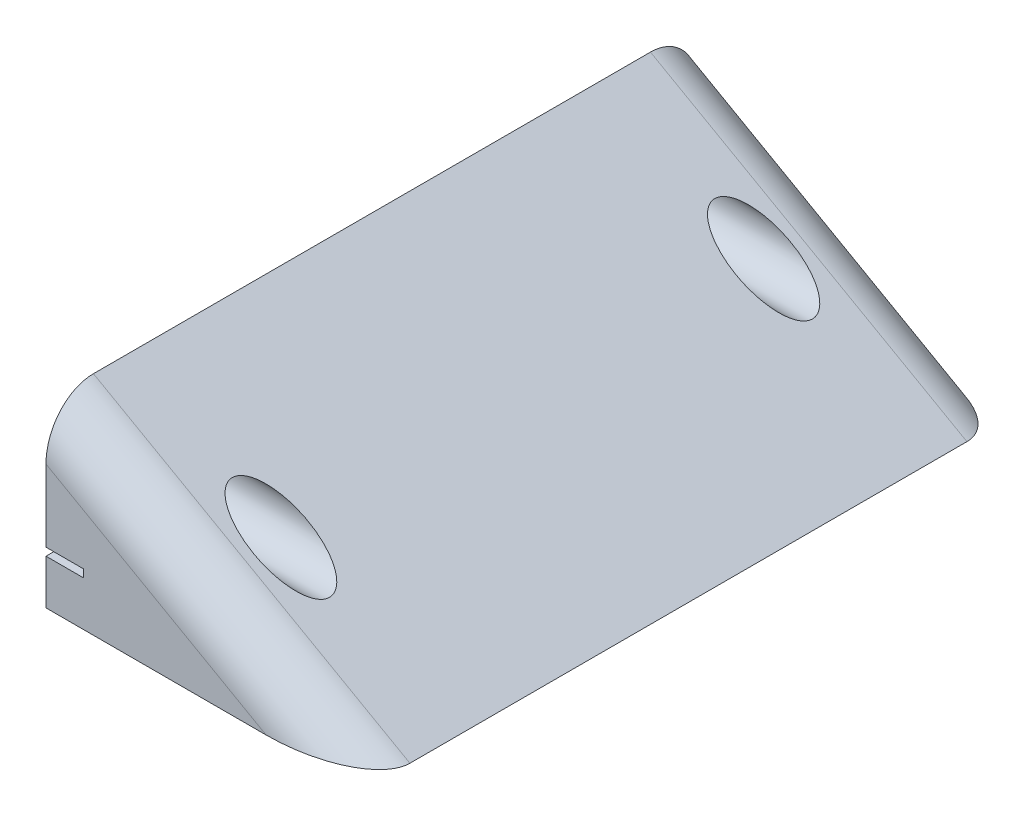
ISO-10303-21;
HEADER;
FILE_DESCRIPTION(('STEP AP214'),'2;1');
FILE_NAME('part.step','',(''),(''),'','','');
FILE_SCHEMA(('AUTOMOTIVE_DESIGN { 1 0 10303 214 1 1 1 1 }'));
ENDSEC;
DATA;
#1=APPLICATION_CONTEXT('core data for automotive mechanical design processes');
#2=APPLICATION_PROTOCOL_DEFINITION('international standard','automotive_design',2000,#1);
#3=PRODUCT_CONTEXT('',#1,'mechanical');
#4=PRODUCT('Part','Part','',(#3));
#5=PRODUCT_RELATED_PRODUCT_CATEGORY('part','',(#4));
#6=PRODUCT_DEFINITION_FORMATION('','',#4);
#7=PRODUCT_DEFINITION_CONTEXT('part definition',#1,'design');
#8=PRODUCT_DEFINITION('design','',#6,#7);
#9=PRODUCT_DEFINITION_SHAPE('','',#8);
#10=(LENGTH_UNIT() NAMED_UNIT(*) SI_UNIT(.MILLI.,.METRE.));
#11=(NAMED_UNIT(*) PLANE_ANGLE_UNIT() SI_UNIT($,.RADIAN.));
#12=(NAMED_UNIT(*) SI_UNIT($,.STERADIAN.) SOLID_ANGLE_UNIT());
#13=UNCERTAINTY_MEASURE_WITH_UNIT(LENGTH_MEASURE(1.E-05),#10,'distance_accuracy_value','');
#14=(GEOMETRIC_REPRESENTATION_CONTEXT(3) GLOBAL_UNCERTAINTY_ASSIGNED_CONTEXT((#13)) GLOBAL_UNIT_ASSIGNED_CONTEXT((#10,
#11,#12)) REPRESENTATION_CONTEXT('',''));
#15=CARTESIAN_POINT('',(0.,0.,0.));
#16=DIRECTION('',(0.,0.,1.));
#17=DIRECTION('',(1.,0.,0.));
#18=AXIS2_PLACEMENT_3D('',#15,#16,#17);
#19=CARTESIAN_POINT('',(0.,0.,261.62));
#20=DIRECTION('',(1.,0.,0.));
#21=DIRECTION('',(0.,0.,-1.));
#22=AXIS2_PLACEMENT_3D('',#19,#20,#21);
#23=PLANE('',#22);
#24=DIRECTION('',(0.,-1.,0.));
#25=VECTOR('',#24,1.);
#26=CARTESIAN_POINT('',(0.,0.,261.62));
#27=LINE('',#26,#25);
#28=CARTESIAN_POINT('',(0.,17.976314939689,261.62));
#29=VERTEX_POINT('',#28);
#30=CARTESIAN_POINT('',(0.,0.,261.62));
#31=VERTEX_POINT('',#30);
#32=EDGE_CURVE('E179',#29,#31,#27,.T.);
#33=ORIENTED_EDGE('',*,*,#32,.F.);
#34=DIRECTION('',(0.,0.,1.));
#35=VECTOR('',#34,1.);
#36=CARTESIAN_POINT('',(0.,17.976314939689,-6.604));
#37=LINE('',#36,#35);
#38=CARTESIAN_POINT('',(0.,17.976314939689,0.));
#39=VERTEX_POINT('',#38);
#40=EDGE_CURVE('E155',#39,#29,#37,.T.);
#41=ORIENTED_EDGE('',*,*,#40,.F.);
#42=DIRECTION('',(0.,-1.,0.));
#43=VECTOR('',#42,1.);
#44=CARTESIAN_POINT('',(0.,0.,0.));
#45=LINE('',#44,#43);
#46=CARTESIAN_POINT('',(0.,0.,0.));
#47=VERTEX_POINT('',#46);
#48=EDGE_CURVE('E186',#39,#47,#45,.T.);
#49=ORIENTED_EDGE('',*,*,#48,.T.);
#50=DIRECTION('',(0.,0.,-1.));
#51=VECTOR('',#50,1.);
#52=CARTESIAN_POINT('',(0.,0.,261.62));
#53=LINE('',#52,#51);
#54=EDGE_CURVE('E183',#31,#47,#53,.T.);
#55=ORIENTED_EDGE('',*,*,#54,.F.);
#56=EDGE_LOOP('',(#33,#41,#49,#55));
#57=FACE_BOUND('',#56,.T.);
#58=ADVANCED_FACE('F44',(#57),#23,.F.);
#59=CARTESIAN_POINT('',(0.,0.,261.62));
#60=DIRECTION('',(0.,1.,0.));
#61=DIRECTION('',(0.,0.,1.));
#62=AXIS2_PLACEMENT_3D('',#59,#60,#61);
#63=PLANE('',#62);
#64=DIRECTION('',(0.,0.,-1.));
#65=VECTOR('',#64,1.);
#66=CARTESIAN_POINT('',(127.,0.,261.62));
#67=LINE('',#66,#65);
#68=CARTESIAN_POINT('',(127.,0.,242.57));
#69=VERTEX_POINT('',#68);
#70=CARTESIAN_POINT('',(127.,0.,19.05));
#71=VERTEX_POINT('',#70);
#72=EDGE_CURVE('E196',#69,#71,#67,.T.);
#73=ORIENTED_EDGE('',*,*,#72,.F.);
#74=CARTESIAN_POINT('',(88.3255567421224,0.,242.57));
#75=DIRECTION('',(0.,1.,0.));
#76=DIRECTION('',(1.,0.,0.));
#77=AXIS2_PLACEMENT_3D('',#74,#75,#76);
#78=ELLIPSE('',#77,38.6744432578776,19.05);
#79=CARTESIAN_POINT('',(88.3255567421224,0.,261.62));
#80=VERTEX_POINT('',#79);
#81=EDGE_CURVE('E53',#69,#80,#78,.F.);
#82=ORIENTED_EDGE('',*,*,#81,.T.);
#83=DIRECTION('',(1.,0.,0.));
#84=VECTOR('',#83,1.);
#85=CARTESIAN_POINT('',(0.,0.,261.62));
#86=LINE('',#85,#84);
#87=EDGE_CURVE('E176',#31,#80,#86,.T.);
#88=ORIENTED_EDGE('',*,*,#87,.F.);
#89=ORIENTED_EDGE('',*,*,#54,.T.);
#90=DIRECTION('',(1.,0.,0.));
#91=VECTOR('',#90,1.);
#92=CARTESIAN_POINT('',(0.,0.,0.));
#93=LINE('',#92,#91);
#94=CARTESIAN_POINT('',(88.3255567421224,0.,0.));
#95=VERTEX_POINT('',#94);
#96=EDGE_CURVE('E175',#47,#95,#93,.T.);
#97=ORIENTED_EDGE('',*,*,#96,.T.);
#98=CARTESIAN_POINT('',(88.3255567421224,0.,19.05));
#99=DIRECTION('',(0.,1.,0.));
#100=DIRECTION('',(-1.,0.,0.));
#101=AXIS2_PLACEMENT_3D('',#98,#99,#100);
#102=ELLIPSE('',#101,38.6744432578776,19.05);
#103=EDGE_CURVE('E65',#95,#71,#102,.F.);
#104=ORIENTED_EDGE('',*,*,#103,.T.);
#105=EDGE_LOOP('',(#73,#82,#88,#89,#97,#104));
#106=FACE_BOUND('',#105,.T.);
#107=ADVANCED_FACE('F228',(#106),#63,.F.);
#108=CARTESIAN_POINT('',(0.,71.882,261.62));
#109=DIRECTION('',(-0.492573348062863,-0.870270932973256,0.));
#110=DIRECTION('',(0.870270932973256,-0.492573348062863,0.));
#111=AXIS2_PLACEMENT_3D('',#108,#109,#110);
#112=PLANE('',#111);
#113=CARTESIAN_POINT('',(60.3586572438163,37.719,34.0011761452781));
#114=DIRECTION('',(-0.492573348062863,-0.870270932973256,0.));
#115=DIRECTION('',(-0.870270932973256,0.492573348062863,0.));
#116=AXIS2_PLACEMENT_3D('',#113,#114,#115);
#117=ELLIPSE('',#116,22.5419220593044,11.1035500205237);
#118=CARTESIAN_POINT('',(40.741077702255,48.8225500205237,34.0011761452781));
#119=VERTEX_POINT('',#118);
#120=EDGE_CURVE('E171',#119,#119,#117,.T.);
#121=ORIENTED_EDGE('',*,*,#120,.T.);
#122=EDGE_LOOP('',(#121));
#123=FACE_BOUND('',#122,.T.);
#124=CARTESIAN_POINT('',(60.3586572438163,37.719,227.711));
#125=DIRECTION('',(-0.492573348062863,-0.870270932973256,0.));
#126=DIRECTION('',(-0.870270932973256,0.492573348062863,0.));
#127=AXIS2_PLACEMENT_3D('',#124,#125,#126);
#128=ELLIPSE('',#127,22.431177089569,11.049);
#129=CARTESIAN_POINT('',(40.8374558303887,48.768,227.711));
#130=VERTEX_POINT('',#129);
#131=EDGE_CURVE('E164',#130,#130,#128,.T.);
#132=ORIENTED_EDGE('',*,*,#131,.T.);
#133=EDGE_LOOP('',(#132));
#134=FACE_BOUND('',#133,.T.);
#135=DIRECTION('',(0.,0.,-1.));
#136=VECTOR('',#135,1.);
#137=CARTESIAN_POINT('',(0.,71.882,261.62));
#138=LINE('',#137,#136);
#139=CARTESIAN_POINT('',(0.,71.882,242.57));
#140=VERTEX_POINT('',#139);
#141=CARTESIAN_POINT('',(0.,71.882,19.05));
#142=VERTEX_POINT('',#141);
#143=EDGE_CURVE('E192',#140,#142,#138,.T.);
#144=ORIENTED_EDGE('',*,*,#143,.F.);
#145=DIRECTION('',(-0.870270932973256,0.492573348062863,0.));
#146=VECTOR('',#145,1.);
#147=CARTESIAN_POINT('',(127.,0.,242.57));
#148=LINE('',#147,#146);
#149=EDGE_CURVE('E221',#140,#69,#148,.F.);
#150=ORIENTED_EDGE('',*,*,#149,.T.);
#151=ORIENTED_EDGE('',*,*,#72,.T.);
#152=DIRECTION('',(-0.870270932973256,0.492573348062863,0.));
#153=VECTOR('',#152,1.);
#154=CARTESIAN_POINT('',(0.,71.882,19.05));
#155=LINE('',#154,#153);
#156=EDGE_CURVE('E217',#71,#142,#155,.T.);
#157=ORIENTED_EDGE('',*,*,#156,.T.);
#158=EDGE_LOOP('',(#144,#150,#151,#157));
#159=FACE_BOUND('',#158,.T.);
#160=ADVANCED_FACE('F239',(#123,#134,#159),#112,.F.);
#161=CARTESIAN_POINT('',(0.,37.719,34.0011761452781));
#162=DIRECTION('',(-1.,0.,0.));
#163=DIRECTION('',(0.,0.,1.));
#164=AXIS2_PLACEMENT_3D('',#161,#162,#163);
#165=CIRCLE('',#164,11.1035500205237);
#166=CARTESIAN_POINT('',(0.,37.719,45.1047261658018));
#167=VERTEX_POINT('',#166);
#168=EDGE_CURVE('E160',#167,#167,#165,.T.);
#169=ORIENTED_EDGE('',*,*,#168,.F.);
#170=EDGE_LOOP('',(#169));
#171=FACE_BOUND('',#170,.T.);
#172=CARTESIAN_POINT('',(0.,37.719,227.711));
#173=DIRECTION('',(-1.,0.,0.));
#174=DIRECTION('',(0.,0.,1.));
#175=AXIS2_PLACEMENT_3D('',#172,#173,#174);
#176=CIRCLE('',#175,11.049);
#177=CARTESIAN_POINT('',(0.,37.719,238.76));
#178=VERTEX_POINT('',#177);
#179=EDGE_CURVE('E154',#178,#178,#176,.T.);
#180=ORIENTED_EDGE('',*,*,#179,.F.);
#181=EDGE_LOOP('',(#180));
#182=FACE_BOUND('',#181,.T.);
#183=CARTESIAN_POINT('',(0.,49.9922651160413,261.62));
#184=VERTEX_POINT('',#183);
#185=CARTESIAN_POINT('',(0.,21.1006079936563,261.62));
#186=VERTEX_POINT('',#185);
#187=EDGE_CURVE('E146',#184,#186,#27,.T.);
#188=ORIENTED_EDGE('',*,*,#187,.F.);
#189=CARTESIAN_POINT('',(0.,49.9922651160413,242.57));
#190=DIRECTION('',(1.,0.,0.));
#191=DIRECTION('',(0.,-1.,0.));
#192=AXIS2_PLACEMENT_3D('',#189,#190,#191);
#193=ELLIPSE('',#192,21.8897348839587,19.05);
#194=EDGE_CURVE('E214',#184,#140,#193,.F.);
#195=ORIENTED_EDGE('',*,*,#194,.T.);
#196=ORIENTED_EDGE('',*,*,#143,.T.);
#197=CARTESIAN_POINT('',(0.,49.9922651160413,19.05));
#198=DIRECTION('',(1.,0.,0.));
#199=DIRECTION('',(0.,1.,0.));
#200=AXIS2_PLACEMENT_3D('',#197,#198,#199);
#201=ELLIPSE('',#200,21.8897348839587,19.05);
#202=CARTESIAN_POINT('',(0.,49.9922651160413,0.));
#203=VERTEX_POINT('',#202);
#204=EDGE_CURVE('E211',#142,#203,#201,.F.);
#205=ORIENTED_EDGE('',*,*,#204,.T.);
#206=CARTESIAN_POINT('',(0.,21.1006079936563,0.));
#207=VERTEX_POINT('',#206);
#208=EDGE_CURVE('E180',#203,#207,#45,.T.);
#209=ORIENTED_EDGE('',*,*,#208,.T.);
#210=DIRECTION('',(0.,0.,1.));
#211=VECTOR('',#210,1.);
#212=CARTESIAN_POINT('',(0.,21.1006079936563,-6.604));
#213=LINE('',#212,#211);
#214=EDGE_CURVE('E129',#207,#186,#213,.T.);
#215=ORIENTED_EDGE('',*,*,#214,.T.);
#216=EDGE_LOOP('',(#188,#195,#196,#205,#209,#215));
#217=FACE_BOUND('',#216,.T.);
#218=ADVANCED_FACE('F237',(#171,#182,#217),#23,.F.);
#219=CARTESIAN_POINT('',(0.,0.,261.62));
#220=DIRECTION('',(0.,0.,1.));
#221=DIRECTION('',(1.,0.,0.));
#222=AXIS2_PLACEMENT_3D('',#219,#220,#221);
#223=PLANE('',#222);
#224=ORIENTED_EDGE('',*,*,#87,.T.);
#225=DIRECTION('',(-0.870270932973256,0.492573348062863,0.));
#226=VECTOR('',#225,1.);
#227=CARTESIAN_POINT('',(-9.38352228059755,55.3033387268595,261.62));
#228=LINE('',#227,#226);
#229=EDGE_CURVE('E208',#80,#184,#228,.T.);
#230=ORIENTED_EDGE('',*,*,#229,.T.);
#231=ORIENTED_EDGE('',*,*,#187,.T.);
#232=DIRECTION('',(-1.,0.,0.));
#233=VECTOR('',#232,1.);
#234=CARTESIAN_POINT('',(14.986,21.1006079936563,261.62));
#235=LINE('',#234,#233);
#236=CARTESIAN_POINT('',(14.986,21.1006079936563,261.62));
#237=VERTEX_POINT('',#236);
#238=EDGE_CURVE('E122',#237,#186,#235,.T.);
#239=ORIENTED_EDGE('',*,*,#238,.F.);
#240=DIRECTION('',(0.,1.,0.));
#241=VECTOR('',#240,1.);
#242=CARTESIAN_POINT('',(14.986,21.1006079936563,261.62));
#243=LINE('',#242,#241);
#244=CARTESIAN_POINT('',(14.986,17.976314939689,261.62));
#245=VERTEX_POINT('',#244);
#246=EDGE_CURVE('E133',#245,#237,#243,.T.);
#247=ORIENTED_EDGE('',*,*,#246,.F.);
#248=DIRECTION('',(1.,0.,0.));
#249=VECTOR('',#248,1.);
#250=CARTESIAN_POINT('',(14.986,17.976314939689,261.62));
#251=LINE('',#250,#249);
#252=EDGE_CURVE('E130',#29,#245,#251,.T.);
#253=ORIENTED_EDGE('',*,*,#252,.F.);
#254=ORIENTED_EDGE('',*,*,#32,.T.);
#255=EDGE_LOOP('',(#224,#230,#231,#239,#247,#253,#254));
#256=FACE_BOUND('',#255,.T.);
#257=ADVANCED_FACE('F143',(#256),#223,.T.);
#258=CARTESIAN_POINT('',(0.,0.,0.));
#259=DIRECTION('',(0.,0.,1.));
#260=DIRECTION('',(1.,0.,0.));
#261=AXIS2_PLACEMENT_3D('',#258,#259,#260);
#262=PLANE('',#261);
#263=ORIENTED_EDGE('',*,*,#208,.F.);
#264=DIRECTION('',(-0.870270932973256,0.492573348062863,0.));
#265=VECTOR('',#264,1.);
#266=CARTESIAN_POINT('',(21.4302976285785,37.8627166582658,0.));
#267=LINE('',#266,#265);
#268=EDGE_CURVE('E11',#203,#95,#267,.F.);
#269=ORIENTED_EDGE('',*,*,#268,.T.);
#270=ORIENTED_EDGE('',*,*,#96,.F.);
#271=ORIENTED_EDGE('',*,*,#48,.F.);
#272=DIRECTION('',(1.,0.,0.));
#273=VECTOR('',#272,1.);
#274=CARTESIAN_POINT('',(0.,17.976314939689,0.));
#275=LINE('',#274,#273);
#276=CARTESIAN_POINT('',(14.986,17.976314939689,0.));
#277=VERTEX_POINT('',#276);
#278=EDGE_CURVE('E204',#39,#277,#275,.T.);
#279=ORIENTED_EDGE('',*,*,#278,.T.);
#280=DIRECTION('',(0.,1.,0.));
#281=VECTOR('',#280,1.);
#282=CARTESIAN_POINT('',(14.986,0.,0.));
#283=LINE('',#282,#281);
#284=CARTESIAN_POINT('',(14.986,21.1006079936563,0.));
#285=VERTEX_POINT('',#284);
#286=EDGE_CURVE('E201',#277,#285,#283,.T.);
#287=ORIENTED_EDGE('',*,*,#286,.T.);
#288=DIRECTION('',(-1.,0.,0.));
#289=VECTOR('',#288,1.);
#290=CARTESIAN_POINT('',(0.,21.1006079936563,0.));
#291=LINE('',#290,#289);
#292=EDGE_CURVE('E125',#285,#207,#291,.T.);
#293=ORIENTED_EDGE('',*,*,#292,.T.);
#294=EDGE_LOOP('',(#263,#269,#270,#271,#279,#287,#293));
#295=FACE_BOUND('',#294,.T.);
#296=ADVANCED_FACE('F242',(#295),#262,.F.);
#297=CARTESIAN_POINT('',(109.728,37.719,227.711));
#298=DIRECTION('',(-1.,0.,0.));
#299=DIRECTION('',(0.,0.,1.));
#300=AXIS2_PLACEMENT_3D('',#297,#298,#299);
#301=CYLINDRICAL_SURFACE('',#300,11.049);
#302=ORIENTED_EDGE('',*,*,#179,.T.);
#303=EDGE_LOOP('',(#302));
#304=FACE_BOUND('',#303,.T.);
#305=ORIENTED_EDGE('',*,*,#131,.F.);
#306=EDGE_LOOP('',(#305));
#307=FACE_BOUND('',#306,.T.);
#308=ADVANCED_FACE('F272',(#304,#307),#301,.F.);
#309=CARTESIAN_POINT('',(109.728,37.719,34.0011761452781));
#310=DIRECTION('',(-1.,0.,0.));
#311=DIRECTION('',(0.,0.,1.));
#312=AXIS2_PLACEMENT_3D('',#309,#310,#311);
#313=CYLINDRICAL_SURFACE('',#312,11.1035500205237);
#314=ORIENTED_EDGE('',*,*,#168,.T.);
#315=EDGE_LOOP('',(#314));
#316=FACE_BOUND('',#315,.T.);
#317=ORIENTED_EDGE('',*,*,#120,.F.);
#318=EDGE_LOOP('',(#317));
#319=FACE_BOUND('',#318,.T.);
#320=ADVANCED_FACE('F275',(#316,#319),#313,.F.);
#321=CARTESIAN_POINT('',(14.986,21.1006079936563,-6.604));
#322=DIRECTION('',(1.,0.,0.));
#323=DIRECTION('',(0.,1.,0.));
#324=AXIS2_PLACEMENT_3D('',#321,#322,#323);
#325=PLANE('',#324);
#326=DIRECTION('',(0.,0.,1.));
#327=VECTOR('',#326,1.);
#328=CARTESIAN_POINT('',(14.986,17.976314939689,-6.604));
#329=LINE('',#328,#327);
#330=EDGE_CURVE('E136',#277,#245,#329,.T.);
#331=ORIENTED_EDGE('',*,*,#330,.T.);
#332=ORIENTED_EDGE('',*,*,#246,.T.);
#333=DIRECTION('',(0.,0.,1.));
#334=VECTOR('',#333,1.);
#335=CARTESIAN_POINT('',(14.986,21.1006079936563,-6.604));
#336=LINE('',#335,#334);
#337=EDGE_CURVE('E117',#285,#237,#336,.T.);
#338=ORIENTED_EDGE('',*,*,#337,.F.);
#339=ORIENTED_EDGE('',*,*,#286,.F.);
#340=EDGE_LOOP('',(#331,#332,#338,#339));
#341=FACE_BOUND('',#340,.T.);
#342=ADVANCED_FACE('F134',(#341),#325,.F.);
#343=CARTESIAN_POINT('',(14.986,17.976314939689,-6.604));
#344=DIRECTION('',(0.,-1.,0.));
#345=DIRECTION('',(0.,0.,-1.));
#346=AXIS2_PLACEMENT_3D('',#343,#344,#345);
#347=PLANE('',#346);
#348=ORIENTED_EDGE('',*,*,#40,.T.);
#349=ORIENTED_EDGE('',*,*,#252,.T.);
#350=ORIENTED_EDGE('',*,*,#330,.F.);
#351=ORIENTED_EDGE('',*,*,#278,.F.);
#352=EDGE_LOOP('',(#348,#349,#350,#351));
#353=FACE_BOUND('',#352,.T.);
#354=ADVANCED_FACE('F245',(#353),#347,.F.);
#355=CARTESIAN_POINT('',(14.986,21.1006079936563,-6.604));
#356=DIRECTION('',(0.,1.,0.));
#357=DIRECTION('',(-1.,0.,0.));
#358=AXIS2_PLACEMENT_3D('',#355,#356,#357);
#359=PLANE('',#358);
#360=ORIENTED_EDGE('',*,*,#337,.T.);
#361=ORIENTED_EDGE('',*,*,#238,.T.);
#362=ORIENTED_EDGE('',*,*,#214,.F.);
#363=ORIENTED_EDGE('',*,*,#292,.F.);
#364=EDGE_LOOP('',(#360,#361,#362,#363));
#365=FACE_BOUND('',#364,.T.);
#366=ADVANCED_FACE('F119',(#365),#359,.F.);
#367=CARTESIAN_POINT('',(21.4302976285785,37.8627166582658,242.57));
#368=DIRECTION('',(0.870270932973256,-0.492573348062863,0.));
#369=DIRECTION('',(0.492573348062863,0.870270932973256,0.));
#370=AXIS2_PLACEMENT_3D('',#367,#368,#369);
#371=CYLINDRICAL_SURFACE('',#370,19.05);
#372=ORIENTED_EDGE('',*,*,#81,.F.);
#373=ORIENTED_EDGE('',*,*,#149,.F.);
#374=ORIENTED_EDGE('',*,*,#194,.F.);
#375=ORIENTED_EDGE('',*,*,#229,.F.);
#376=EDGE_LOOP('',(#372,#373,#374,#375));
#377=FACE_BOUND('',#376,.T.);
#378=ADVANCED_FACE('F234',(#377),#371,.T.);
#379=CARTESIAN_POINT('',(-9.38352228059754,55.3033387268595,19.05));
#380=DIRECTION('',(-0.870270932973256,0.492573348062863,0.));
#381=DIRECTION('',(-0.492573348062863,-0.870270932973256,0.));
#382=AXIS2_PLACEMENT_3D('',#379,#380,#381);
#383=CYLINDRICAL_SURFACE('',#382,19.05);
#384=ORIENTED_EDGE('',*,*,#103,.F.);
#385=ORIENTED_EDGE('',*,*,#268,.F.);
#386=ORIENTED_EDGE('',*,*,#204,.F.);
#387=ORIENTED_EDGE('',*,*,#156,.F.);
#388=EDGE_LOOP('',(#384,#385,#386,#387));
#389=FACE_BOUND('',#388,.T.);
#390=ADVANCED_FACE('F46',(#389),#383,.T.);
#391=CLOSED_SHELL('',(#58,#107,#160,#218,#257,#296,#308,#320,#342,#354,#366,#378,#390));
#392=MANIFOLD_SOLID_BREP('B2',#391);
#393=ADVANCED_BREP_SHAPE_REPRESENTATION('',(#18,#392),#14);
#394=SHAPE_DEFINITION_REPRESENTATION(#9,#393);
ENDSEC;
END-ISO-10303-21;
